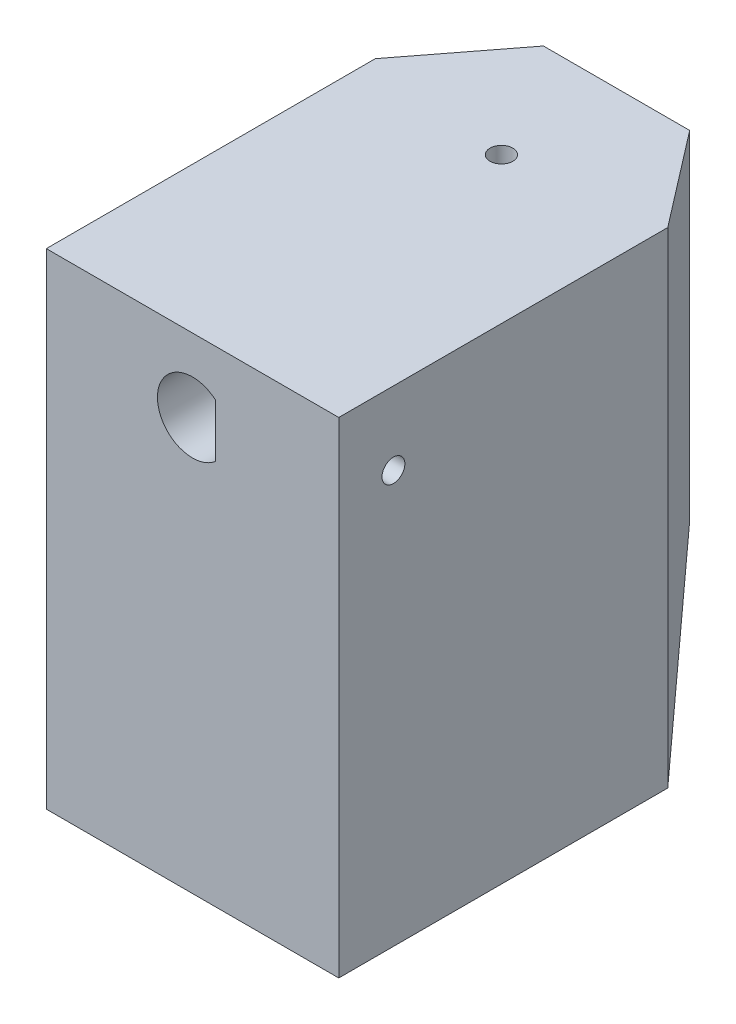
ISO-10303-21;
HEADER;
FILE_DESCRIPTION(('STEP AP214'),'2;1');
FILE_NAME('part.step','',(''),(''),'','','');
FILE_SCHEMA(('AUTOMOTIVE_DESIGN { 1 0 10303 214 1 1 1 1 }'));
ENDSEC;
DATA;
#1=APPLICATION_CONTEXT('core data for automotive mechanical design processes');
#2=APPLICATION_PROTOCOL_DEFINITION('international standard','automotive_design',2000,#1);
#3=PRODUCT_CONTEXT('',#1,'mechanical');
#4=PRODUCT('Part','Part','',(#3));
#5=PRODUCT_RELATED_PRODUCT_CATEGORY('part','',(#4));
#6=PRODUCT_DEFINITION_FORMATION('','',#4);
#7=PRODUCT_DEFINITION_CONTEXT('part definition',#1,'design');
#8=PRODUCT_DEFINITION('design','',#6,#7);
#9=PRODUCT_DEFINITION_SHAPE('','',#8);
#10=(LENGTH_UNIT() NAMED_UNIT(*) SI_UNIT(.MILLI.,.METRE.));
#11=(NAMED_UNIT(*) PLANE_ANGLE_UNIT() SI_UNIT($,.RADIAN.));
#12=(NAMED_UNIT(*) SI_UNIT($,.STERADIAN.) SOLID_ANGLE_UNIT());
#13=UNCERTAINTY_MEASURE_WITH_UNIT(LENGTH_MEASURE(1.E-05),#10,'distance_accuracy_value','');
#14=(GEOMETRIC_REPRESENTATION_CONTEXT(3) GLOBAL_UNCERTAINTY_ASSIGNED_CONTEXT((#13)) GLOBAL_UNIT_ASSIGNED_CONTEXT((#10,
#11,#12)) REPRESENTATION_CONTEXT('',''));
#15=CARTESIAN_POINT('',(0.,0.,0.));
#16=DIRECTION('',(0.,0.,1.));
#17=DIRECTION('',(1.,0.,0.));
#18=AXIS2_PLACEMENT_3D('',#15,#16,#17);
#19=CARTESIAN_POINT('',(12.7,0.,25.4));
#20=DIRECTION('',(1.,0.,0.));
#21=DIRECTION('',(0.,1.,0.));
#22=AXIS2_PLACEMENT_3D('',#19,#20,#21);
#23=PLANE('',#22);
#24=CARTESIAN_POINT('',(12.7,0.,20.65));
#25=DIRECTION('',(1.,0.,0.));
#26=DIRECTION('',(0.,1.,0.));
#27=AXIS2_PLACEMENT_3D('',#24,#25,#26);
#28=CIRCLE('',#27,0.992187500000001);
#29=CARTESIAN_POINT('',(12.7,0.9921875,20.65));
#30=VERTEX_POINT('',#29);
#31=EDGE_CURVE('E257',#30,#30,#28,.T.);
#32=ORIENTED_EDGE('',*,*,#31,.F.);
#33=EDGE_LOOP('',(#32));
#34=FACE_BOUND('',#33,.T.);
#35=DIRECTION('',(0.,-1.,0.));
#36=VECTOR('',#35,1.);
#37=CARTESIAN_POINT('',(12.7,6.351,-3.175));
#38=LINE('',#37,#36);
#39=CARTESIAN_POINT('',(12.7,6.35,-3.175));
#40=VERTEX_POINT('',#39);
#41=CARTESIAN_POINT('',(12.7,-35.814,-3.175));
#42=VERTEX_POINT('',#41);
#43=EDGE_CURVE('E185',#40,#42,#38,.T.);
#44=ORIENTED_EDGE('',*,*,#43,.F.);
#45=DIRECTION('',(0.,0.,1.));
#46=VECTOR('',#45,1.);
#47=CARTESIAN_POINT('',(12.7,6.35,-11.43));
#48=LINE('',#47,#46);
#49=CARTESIAN_POINT('',(12.7,6.35,25.4));
#50=VERTEX_POINT('',#49);
#51=EDGE_CURVE('E60',#40,#50,#48,.T.);
#52=ORIENTED_EDGE('',*,*,#51,.T.);
#53=DIRECTION('',(0.,-1.,0.));
#54=VECTOR('',#53,1.);
#55=CARTESIAN_POINT('',(12.7,0.,25.4));
#56=LINE('',#55,#54);
#57=CARTESIAN_POINT('',(12.7,-35.814,25.4));
#58=VERTEX_POINT('',#57);
#59=EDGE_CURVE('E172',#50,#58,#56,.T.);
#60=ORIENTED_EDGE('',*,*,#59,.T.);
#61=DIRECTION('',(0.,0.,-1.));
#62=VECTOR('',#61,1.);
#63=CARTESIAN_POINT('',(12.7,-35.814,25.4));
#64=LINE('',#63,#62);
#65=EDGE_CURVE('E53',#58,#42,#64,.T.);
#66=ORIENTED_EDGE('',*,*,#65,.T.);
#67=EDGE_LOOP('',(#44,#52,#60,#66));
#68=FACE_BOUND('',#67,.T.);
#69=ADVANCED_FACE('F44',(#34,#68),#23,.T.);
#70=CARTESIAN_POINT('',(0.,6.35,25.4));
#71=DIRECTION('',(0.,1.,0.));
#72=DIRECTION('',(-1.,0.,0.));
#73=AXIS2_PLACEMENT_3D('',#70,#71,#72);
#74=PLANE('',#73);
#75=CARTESIAN_POINT('',(0.,6.35,-1.43));
#76=DIRECTION('',(0.,1.,0.));
#77=DIRECTION('',(-1.,0.,0.));
#78=AXIS2_PLACEMENT_3D('',#75,#76,#77);
#79=CIRCLE('',#78,0.9921875);
#80=CARTESIAN_POINT('',(-0.992187500000001,6.35,-1.43));
#81=VERTEX_POINT('',#80);
#82=EDGE_CURVE('E261',#81,#81,#79,.T.);
#83=ORIENTED_EDGE('',*,*,#82,.F.);
#84=EDGE_LOOP('',(#83));
#85=FACE_BOUND('',#84,.T.);
#86=DIRECTION('',(0.,0.,1.));
#87=VECTOR('',#86,1.);
#88=CARTESIAN_POINT('',(-12.7,6.35,-11.43));
#89=LINE('',#88,#87);
#90=CARTESIAN_POINT('',(-12.7,6.35,-3.175));
#91=VERTEX_POINT('',#90);
#92=CARTESIAN_POINT('',(-12.7,6.35,25.4));
#93=VERTEX_POINT('',#92);
#94=EDGE_CURVE('E150',#91,#93,#89,.T.);
#95=ORIENTED_EDGE('',*,*,#94,.T.);
#96=DIRECTION('',(1.,0.,0.));
#97=VECTOR('',#96,1.);
#98=CARTESIAN_POINT('',(0.,6.35,25.4));
#99=LINE('',#98,#97);
#100=EDGE_CURVE('E154',#93,#50,#99,.T.);
#101=ORIENTED_EDGE('',*,*,#100,.T.);
#102=ORIENTED_EDGE('',*,*,#51,.F.);
#103=DIRECTION('',(-0.609710760849693,0.,-0.7926239891046));
#104=VECTOR('',#103,1.);
#105=CARTESIAN_POINT('',(6.35,6.35,-11.43));
#106=LINE('',#105,#104);
#107=CARTESIAN_POINT('',(6.35,6.35,-11.43));
#108=VERTEX_POINT('',#107);
#109=EDGE_CURVE('E582',#40,#108,#106,.T.);
#110=ORIENTED_EDGE('',*,*,#109,.T.);
#111=DIRECTION('',(1.,0.,0.));
#112=VECTOR('',#111,1.);
#113=CARTESIAN_POINT('',(12.7,6.35,-11.43));
#114=LINE('',#113,#112);
#115=CARTESIAN_POINT('',(-6.35,6.35,-11.43));
#116=VERTEX_POINT('',#115);
#117=EDGE_CURVE('E195',#116,#108,#114,.T.);
#118=ORIENTED_EDGE('',*,*,#117,.F.);
#119=DIRECTION('',(-0.609710760849693,0.,0.7926239891046));
#120=VECTOR('',#119,1.);
#121=CARTESIAN_POINT('',(-12.7,6.35,-3.175));
#122=LINE('',#121,#120);
#123=EDGE_CURVE('E156',#116,#91,#122,.T.);
#124=ORIENTED_EDGE('',*,*,#123,.T.);
#125=EDGE_LOOP('',(#95,#101,#102,#110,#118,#124));
#126=FACE_BOUND('',#125,.T.);
#127=ADVANCED_FACE('F152',(#85,#126),#74,.T.);
#128=CARTESIAN_POINT('',(-12.7,0.,25.4));
#129=DIRECTION('',(1.,0.,0.));
#130=DIRECTION('',(0.,1.,0.));
#131=AXIS2_PLACEMENT_3D('',#128,#129,#130);
#132=PLANE('',#131);
#133=CARTESIAN_POINT('',(-12.7,0.,20.65));
#134=DIRECTION('',(1.,0.,0.));
#135=DIRECTION('',(0.,1.,0.));
#136=AXIS2_PLACEMENT_3D('',#133,#134,#135);
#137=CIRCLE('',#136,0.992187500000001);
#138=CARTESIAN_POINT('',(-12.7,0.992187500000003,20.65));
#139=VERTEX_POINT('',#138);
#140=EDGE_CURVE('E260',#139,#139,#137,.T.);
#141=ORIENTED_EDGE('',*,*,#140,.T.);
#142=EDGE_LOOP('',(#141));
#143=FACE_BOUND('',#142,.T.);
#144=ORIENTED_EDGE('',*,*,#94,.F.);
#145=DIRECTION('',(0.,-1.,0.));
#146=VECTOR('',#145,1.);
#147=CARTESIAN_POINT('',(-12.7,6.351,-3.175));
#148=LINE('',#147,#146);
#149=CARTESIAN_POINT('',(-12.7,-35.814,-3.175));
#150=VERTEX_POINT('',#149);
#151=EDGE_CURVE('E573',#91,#150,#148,.T.);
#152=ORIENTED_EDGE('',*,*,#151,.T.);
#153=DIRECTION('',(0.,0.,-1.));
#154=VECTOR('',#153,1.);
#155=CARTESIAN_POINT('',(-12.7,-35.814,25.4));
#156=LINE('',#155,#154);
#157=CARTESIAN_POINT('',(-12.7,-35.814,25.4));
#158=VERTEX_POINT('',#157);
#159=EDGE_CURVE('E13',#158,#150,#156,.T.);
#160=ORIENTED_EDGE('',*,*,#159,.F.);
#161=DIRECTION('',(0.,-1.,0.));
#162=VECTOR('',#161,1.);
#163=CARTESIAN_POINT('',(-12.7,0.,25.4));
#164=LINE('',#163,#162);
#165=EDGE_CURVE('E163',#93,#158,#164,.T.);
#166=ORIENTED_EDGE('',*,*,#165,.F.);
#167=EDGE_LOOP('',(#144,#152,#160,#166));
#168=FACE_BOUND('',#167,.T.);
#169=ADVANCED_FACE('F164',(#143,#168),#132,.F.);
#170=CARTESIAN_POINT('',(0.,-35.814,25.4));
#171=DIRECTION('',(0.,1.,0.));
#172=DIRECTION('',(0.,0.,1.));
#173=AXIS2_PLACEMENT_3D('',#170,#171,#172);
#174=PLANE('',#173);
#175=DIRECTION('',(0.,0.,1.));
#176=VECTOR('',#175,1.);
#177=CARTESIAN_POINT('',(9.525,-35.814,22.225));
#178=LINE('',#177,#176);
#179=CARTESIAN_POINT('',(9.525,-35.814,3.175));
#180=VERTEX_POINT('',#179);
#181=CARTESIAN_POINT('',(9.525,-35.814,22.225));
#182=VERTEX_POINT('',#181);
#183=EDGE_CURVE('E504',#180,#182,#178,.T.);
#184=ORIENTED_EDGE('',*,*,#183,.F.);
#185=DIRECTION('',(1.,0.,0.));
#186=VECTOR('',#185,1.);
#187=CARTESIAN_POINT('',(-9.525,-35.814,3.175));
#188=LINE('',#187,#186);
#189=CARTESIAN_POINT('',(-9.525,-35.814,3.175));
#190=VERTEX_POINT('',#189);
#191=EDGE_CURVE('E507',#190,#180,#188,.T.);
#192=ORIENTED_EDGE('',*,*,#191,.F.);
#193=DIRECTION('',(0.,0.,-1.));
#194=VECTOR('',#193,1.);
#195=CARTESIAN_POINT('',(-9.525,-35.814,22.225));
#196=LINE('',#195,#194);
#197=CARTESIAN_POINT('',(-9.525,-35.814,22.225));
#198=VERTEX_POINT('',#197);
#199=EDGE_CURVE('E280',#198,#190,#196,.T.);
#200=ORIENTED_EDGE('',*,*,#199,.F.);
#201=DIRECTION('',(-1.,0.,0.));
#202=VECTOR('',#201,1.);
#203=CARTESIAN_POINT('',(-9.525,-35.814,22.225));
#204=LINE('',#203,#202);
#205=EDGE_CURVE('E68',#182,#198,#204,.T.);
#206=ORIENTED_EDGE('',*,*,#205,.F.);
#207=EDGE_LOOP('',(#184,#192,#200,#206));
#208=FACE_BOUND('',#207,.T.);
#209=ORIENTED_EDGE('',*,*,#159,.T.);
#210=DIRECTION('',(1.,0.,0.));
#211=VECTOR('',#210,1.);
#212=CARTESIAN_POINT('',(-14.2885,-35.814,-3.175));
#213=LINE('',#212,#211);
#214=EDGE_CURVE('E190',#150,#42,#213,.T.);
#215=ORIENTED_EDGE('',*,*,#214,.T.);
#216=ORIENTED_EDGE('',*,*,#65,.F.);
#217=DIRECTION('',(1.,0.,0.));
#218=VECTOR('',#217,1.);
#219=CARTESIAN_POINT('',(0.,-35.814,25.4));
#220=LINE('',#219,#218);
#221=EDGE_CURVE('E168',#158,#58,#220,.T.);
#222=ORIENTED_EDGE('',*,*,#221,.F.);
#223=EDGE_LOOP('',(#209,#215,#216,#222));
#224=FACE_BOUND('',#223,.T.);
#225=ADVANCED_FACE('F188',(#208,#224),#174,.F.);
#226=CARTESIAN_POINT('',(0.,0.,25.4));
#227=DIRECTION('',(0.,0.,1.));
#228=DIRECTION('',(1.,0.,0.));
#229=AXIS2_PLACEMENT_3D('',#226,#227,#228);
#230=PLANE('',#229);
#231=ORIENTED_EDGE('',*,*,#100,.F.);
#232=ORIENTED_EDGE('',*,*,#165,.T.);
#233=ORIENTED_EDGE('',*,*,#221,.T.);
#234=ORIENTED_EDGE('',*,*,#59,.F.);
#235=EDGE_LOOP('',(#231,#232,#233,#234));
#236=FACE_BOUND('',#235,.T.);
#237=CARTESIAN_POINT('',(0.,0.,25.4));
#238=DIRECTION('',(0.,0.,1.));
#239=DIRECTION('',(1.,0.,0.));
#240=AXIS2_PLACEMENT_3D('',#237,#238,#239);
#241=CIRCLE('',#240,3.05);
#242=CARTESIAN_POINT('',(2.00312256240101,2.3,25.4));
#243=VERTEX_POINT('',#242);
#244=CARTESIAN_POINT('',(2.00312256240101,-2.3,25.4));
#245=VERTEX_POINT('',#244);
#246=EDGE_CURVE('E160',#243,#245,#241,.T.);
#247=ORIENTED_EDGE('',*,*,#246,.F.);
#248=DIRECTION('',(0.,1.,0.));
#249=VECTOR('',#248,1.);
#250=CARTESIAN_POINT('',(2.00312256240101,2.3,25.4));
#251=LINE('',#250,#249);
#252=EDGE_CURVE('E214',#245,#243,#251,.T.);
#253=ORIENTED_EDGE('',*,*,#252,.F.);
#254=EDGE_LOOP('',(#247,#253));
#255=FACE_BOUND('',#254,.T.);
#256=ADVANCED_FACE('F170',(#236,#255),#230,.T.);
#257=CARTESIAN_POINT('',(0.,0.,15.9));
#258=DIRECTION('',(0.,0.,1.));
#259=DIRECTION('',(1.,0.,0.));
#260=AXIS2_PLACEMENT_3D('',#257,#258,#259);
#261=CYLINDRICAL_SURFACE('',#260,3.05);
#262=CARTESIAN_POINT('',(-2.88410540113286,0.992187500000002,20.65));
#263=CARTESIAN_POINT('',(-2.88410544227333,0.992187499003058,20.5958755878596));
#264=CARTESIAN_POINT('',(-2.88564564639046,0.987743722350948,20.5417506382407));
#265=CARTESIAN_POINT('',(-2.89160993282774,0.970142380682304,20.4350990117294));
#266=CARTESIAN_POINT('',(-2.89603460657639,0.956983028624878,20.382572664925));
#267=CARTESIAN_POINT('',(-2.90721478367813,0.9224574538793,20.2806796461713));
#268=CARTESIAN_POINT('',(-2.91396589215871,0.901106697031612,20.231307223122));
#269=CARTESIAN_POINT('',(-2.9290319786145,0.850856739146813,20.1368299867803));
#270=CARTESIAN_POINT('',(-2.93734727535555,0.821955999031484,20.0917260461827));
#271=CARTESIAN_POINT('',(-2.9549521826214,0.756273448351369,20.0053861005485));
#272=CARTESIAN_POINT('',(-2.96426522492773,0.719258279234333,19.9643323552998));
#273=CARTESIAN_POINT('',(-2.98261770503291,0.638896136400684,19.8888916689228));
#274=CARTESIAN_POINT('',(-2.99165710103225,0.595548201185811,19.8545057420117));
#275=CARTESIAN_POINT('',(-3.00871380936081,0.502427251127224,19.7925587352875));
#276=CARTESIAN_POINT('',(-3.0167003384296,0.452521916038908,19.7651873408911));
#277=CARTESIAN_POINT('',(-3.03047632711017,0.348511403507998,19.7192990230443));
#278=CARTESIAN_POINT('',(-3.03626634888515,0.294407304951968,19.7007798336886));
#279=CARTESIAN_POINT('',(-3.04483101893703,0.185445026179661,19.6737359446256));
#280=CARTESIAN_POINT('',(-3.04769955823871,0.130671786084561,19.6648992986927));
#281=CARTESIAN_POINT('',(-3.05043068306615,0.0203499392450614,19.6564808338436));
#282=CARTESIAN_POINT('',(-3.05029400739354,-0.0351984735751725,19.6568967402816));
#283=CARTESIAN_POINT('',(-3.0470944150492,-0.143290758343074,19.666770826713));
#284=CARTESIAN_POINT('',(-3.04414106581474,-0.195869326720329,19.6758904452371));
#285=CARTESIAN_POINT('',(-3.03577642928814,-0.29870448299637,19.7023549170762));
#286=CARTESIAN_POINT('',(-3.03036497761968,-0.348960915363425,19.7197003204628));
#287=CARTESIAN_POINT('',(-3.01754969538778,-0.446481451629172,19.762329366313));
#288=CARTESIAN_POINT('',(-3.01012123264766,-0.493698981992226,19.787711842417));
#289=CARTESIAN_POINT('',(-2.99404888515526,-0.583306681132967,19.8456139413294));
#290=CARTESIAN_POINT('',(-2.98540467425785,-0.625695548998711,19.8781354806301));
#291=CARTESIAN_POINT('',(-2.96735674542788,-0.70645869874627,19.9511113505771));
#292=CARTESIAN_POINT('',(-2.95793635367576,-0.744566714529424,19.9918566550682));
#293=CARTESIAN_POINT('',(-2.93972858620891,-0.813492417156689,20.079243071153));
#294=CARTESIAN_POINT('',(-2.93094129875284,-0.844309088904597,20.125885002286));
#295=CARTESIAN_POINT('',(-2.91490614917664,-0.898122497898674,20.2245483616709));
#296=CARTESIAN_POINT('',(-2.90767979567869,-0.921012314136455,20.2766318669199));
#297=CARTESIAN_POINT('',(-2.89583486325815,-0.957608885594126,20.384207331038));
#298=CARTESIAN_POINT('',(-2.89121525345138,-0.971319271387314,20.4396979328688));
#299=CARTESIAN_POINT('',(-2.88533839154562,-0.988636876075504,20.5499440962319));
#300=CARTESIAN_POINT('',(-2.88394451250796,-0.992654948014235,20.6046278604142));
#301=CARTESIAN_POINT('',(-2.8842960294371,-0.991633602094448,20.7138948529574));
#302=CARTESIAN_POINT('',(-2.8860408894609,-0.986595730547893,20.7684780968891));
#303=CARTESIAN_POINT('',(-2.89233758463267,-0.967973922785001,20.8741654016898));
#304=CARTESIAN_POINT('',(-2.89679730050704,-0.954670167050479,20.9253248990449));
#305=CARTESIAN_POINT('',(-2.90792133337228,-0.920227585952964,21.0246770677459));
#306=CARTESIAN_POINT('',(-2.91458602922495,-0.899087414054148,21.0728692275519));
#307=CARTESIAN_POINT('',(-2.92962148534836,-0.848836779921624,21.1665496003867));
#308=CARTESIAN_POINT('',(-2.93803814987854,-0.819502534057743,21.2119102118481));
#309=CARTESIAN_POINT('',(-2.95553781207988,-0.75395301969471,21.2972141663049));
#310=CARTESIAN_POINT('',(-2.96462099666982,-0.717735816377705,21.3371559806382));
#311=CARTESIAN_POINT('',(-2.98292990249764,-0.637491602148098,21.4123641680929));
#312=CARTESIAN_POINT('',(-2.99214332635973,-0.59318436675287,21.4473353824276));
#313=CARTESIAN_POINT('',(-3.00926515954649,-0.499105057262503,21.5093625245216));
#314=CARTESIAN_POINT('',(-3.01717362119701,-0.449333202418803,21.5364187696857));
#315=CARTESIAN_POINT('',(-3.03075393221121,-0.346011052220623,21.5815943846169));
#316=CARTESIAN_POINT('',(-3.03644103658824,-0.292489615811174,21.5997749313711));
#317=CARTESIAN_POINT('',(-3.04500428742759,-0.182928910247626,21.6268078899542));
#318=CARTESIAN_POINT('',(-3.04788139509713,-0.126890508929983,21.6356634916205));
#319=CARTESIAN_POINT('',(-3.05043138226181,-0.0165929138099596,21.6435189137842));
#320=CARTESIAN_POINT('',(-3.05024234265781,0.0376331799160615,21.6429434407334));
#321=CARTESIAN_POINT('',(-3.04701763207516,0.145180388094265,21.6329926260583));
#322=CARTESIAN_POINT('',(-3.04398217379008,0.198501569861303,21.6236179419395));
#323=CARTESIAN_POINT('',(-3.03545367873891,0.301958416561305,21.596612386453));
#324=CARTESIAN_POINT('',(-3.02999695832424,0.352129088549445,21.5791033457476));
#325=CARTESIAN_POINT('',(-3.01718794133522,0.448842066153531,21.5364377169793));
#326=CARTESIAN_POINT('',(-3.00983530798857,0.495383725230549,21.5112797700936));
#327=CARTESIAN_POINT('',(-2.993668126611,0.585333264955752,21.4529913889707));
#328=CARTESIAN_POINT('',(-2.98481065485261,0.628569233327403,21.4196077131159));
#329=CARTESIAN_POINT('',(-2.96674391771869,0.708965129504234,21.3462524336054));
#330=CARTESIAN_POINT('',(-2.95753454352048,0.746123158692438,21.3062787791824));
#331=CARTESIAN_POINT('',(-2.93940150193374,0.814693001372457,21.2191195210637));
#332=CARTESIAN_POINT('',(-2.93050078175049,0.845843372263712,21.1717228223373));
#333=CARTESIAN_POINT('',(-2.91441536585923,0.899709614139127,21.072093321709));
#334=CARTESIAN_POINT('',(-2.90723012287973,0.922428176324609,21.0198620695248));
#335=CARTESIAN_POINT('',(-2.89584504366131,0.957550476466852,20.9153043833237));
#336=CARTESIAN_POINT('',(-2.89148992748762,0.97049854817774,20.8631778210159));
#337=CARTESIAN_POINT('',(-2.88562051672608,0.987815759147561,20.7573673637509));
#338=CARTESIAN_POINT('',(-2.88410536032719,0.992187500988832,20.7036839462584));
#339=CARTESIAN_POINT('',(-2.88410540113286,0.992187500000002,20.65));
#340=B_SPLINE_CURVE_WITH_KNOTS('',3,(#262,#263,#264,#265,#266,#267,#268,#269,#270,#271,#272,
#273,#274,#275,#276,#277,#278,#279,#280,#281,#282,#283,#284,#285,#286,#287,#288,#289,#290,#291,
#292,#293,#294,#295,#296,#297,#298,#299,#300,#301,#302,#303,#304,#305,#306,#307,#308,#309,#310,
#311,#312,#313,#314,#315,#316,#317,#318,#319,#320,#321,#322,#323,#324,#325,#326,#327,#328,#329,
#330,#331,#332,#333,#334,#335,#336,#337,#338,#339),.UNSPECIFIED.,.T.,.F.,(4,2,2,2,2,2,2,2,2,2,2,
2,2,2,2,2,2,2,2,2,2,2,2,2,2,2,2,2,2,2,2,2,2,2,2,2,2,2,4),(0.,0.162174630996264,0.32438252456463,
0.486285655638667,0.648221816758152,0.815631303538281,0.983066234419227,1.15463942416469,
1.32616867264438,1.49199254632288,1.65777565433925,1.81736215241872,1.97695932381421,
2.13860074566675,2.30028561358634,2.46924159712235,2.63822108877886,2.80939836914192,
2.98050790680865,3.14422583660701,3.30791581405046,3.46633914965661,3.62478971986229,
3.78808146355611,3.95141917707508,4.12218357997324,4.29294113396466,4.46250449013404,
4.63200982393432,4.79390371610393,4.95578551200371,5.11531727100793,5.27487738729246,
5.44015156575835,5.60547727411764,5.77688035855631,5.94822868870398,6.10913237387438,
6.26998722348073),.UNSPECIFIED.);
#341=CARTESIAN_POINT('',(-2.88410540113286,0.992187500000002,20.65));
#342=VERTEX_POINT('',#341);
#343=EDGE_CURVE('E271',#342,#342,#340,.T.);
#344=ORIENTED_EDGE('',*,*,#343,.T.);
#345=EDGE_LOOP('',(#344));
#346=FACE_BOUND('',#345,.T.);
#347=ORIENTED_EDGE('',*,*,#246,.T.);
#348=DIRECTION('',(0.,0.,1.));
#349=VECTOR('',#348,1.);
#350=CARTESIAN_POINT('',(2.00312256240101,-2.3,15.9));
#351=LINE('',#350,#349);
#352=CARTESIAN_POINT('',(2.00312256240101,-2.3,15.9));
#353=VERTEX_POINT('',#352);
#354=EDGE_CURVE('E218',#353,#245,#351,.T.);
#355=ORIENTED_EDGE('',*,*,#354,.F.);
#356=CARTESIAN_POINT('',(0.,0.,15.9));
#357=DIRECTION('',(0.,0.,1.));
#358=DIRECTION('',(1.,0.,0.));
#359=AXIS2_PLACEMENT_3D('',#356,#357,#358);
#360=CIRCLE('',#359,3.05);
#361=CARTESIAN_POINT('',(2.00312256240101,2.3,15.9));
#362=VERTEX_POINT('',#361);
#363=EDGE_CURVE('E209',#362,#353,#360,.T.);
#364=ORIENTED_EDGE('',*,*,#363,.F.);
#365=DIRECTION('',(0.,0.,1.));
#366=VECTOR('',#365,1.);
#367=CARTESIAN_POINT('',(2.00312256240101,2.3,15.9));
#368=LINE('',#367,#366);
#369=EDGE_CURVE('E176',#362,#243,#368,.T.);
#370=ORIENTED_EDGE('',*,*,#369,.T.);
#371=EDGE_LOOP('',(#347,#355,#364,#370));
#372=FACE_BOUND('',#371,.T.);
#373=ADVANCED_FACE('F234',(#346,#372),#261,.F.);
#374=CARTESIAN_POINT('',(2.00312256240101,2.3,15.9));
#375=DIRECTION('',(1.,0.,0.));
#376=DIRECTION('',(0.,0.,-1.));
#377=AXIS2_PLACEMENT_3D('',#374,#375,#376);
#378=PLANE('',#377);
#379=CARTESIAN_POINT('',(2.00312256240101,0.,20.65));
#380=DIRECTION('',(1.,0.,0.));
#381=DIRECTION('',(0.,0.,-1.));
#382=AXIS2_PLACEMENT_3D('',#379,#380,#381);
#383=CIRCLE('',#382,0.992187500000001);
#384=CARTESIAN_POINT('',(2.00312256240101,0.,19.6578125));
#385=VERTEX_POINT('',#384);
#386=EDGE_CURVE('E47',#385,#385,#383,.T.);
#387=ORIENTED_EDGE('',*,*,#386,.T.);
#388=EDGE_LOOP('',(#387));
#389=FACE_BOUND('',#388,.T.);
#390=ORIENTED_EDGE('',*,*,#252,.T.);
#391=ORIENTED_EDGE('',*,*,#369,.F.);
#392=DIRECTION('',(0.,1.,0.));
#393=VECTOR('',#392,1.);
#394=CARTESIAN_POINT('',(2.00312256240101,2.3,15.9));
#395=LINE('',#394,#393);
#396=EDGE_CURVE('E213',#353,#362,#395,.T.);
#397=ORIENTED_EDGE('',*,*,#396,.F.);
#398=ORIENTED_EDGE('',*,*,#354,.T.);
#399=EDGE_LOOP('',(#390,#391,#397,#398));
#400=FACE_BOUND('',#399,.T.);
#401=ADVANCED_FACE('F230',(#389,#400),#378,.F.);
#402=CARTESIAN_POINT('',(0.,0.,15.9));
#403=DIRECTION('',(0.,0.,1.));
#404=DIRECTION('',(1.,0.,0.));
#405=AXIS2_PLACEMENT_3D('',#402,#403,#404);
#406=PLANE('',#405);
#407=ORIENTED_EDGE('',*,*,#363,.T.);
#408=ORIENTED_EDGE('',*,*,#396,.T.);
#409=EDGE_LOOP('',(#407,#408));
#410=FACE_BOUND('',#409,.T.);
#411=ADVANCED_FACE('F236',(#410),#406,.T.);
#412=CARTESIAN_POINT('',(0.,0.,-11.43));
#413=DIRECTION('',(0.,0.,-1.));
#414=DIRECTION('',(-1.,0.,0.));
#415=AXIS2_PLACEMENT_3D('',#412,#413,#414);
#416=PLANE('',#415);
#417=CARTESIAN_POINT('',(0.,0.,-11.43));
#418=DIRECTION('',(0.,0.,-1.));
#419=DIRECTION('',(-1.,0.,0.));
#420=AXIS2_PLACEMENT_3D('',#417,#418,#419);
#421=CIRCLE('',#420,3.302);
#422=CARTESIAN_POINT('',(1.651,2.85961588329622,-11.43));
#423=VERTEX_POINT('',#422);
#424=CARTESIAN_POINT('',(-1.651,2.85961588329622,-11.43));
#425=VERTEX_POINT('',#424);
#426=EDGE_CURVE('E545',#423,#425,#421,.T.);
#427=ORIENTED_EDGE('',*,*,#426,.F.);
#428=DIRECTION('',(1.,0.,0.));
#429=VECTOR('',#428,1.);
#430=CARTESIAN_POINT('',(1.651,2.85961588329622,-11.43));
#431=LINE('',#430,#429);
#432=EDGE_CURVE('E551',#425,#423,#431,.T.);
#433=ORIENTED_EDGE('',*,*,#432,.F.);
#434=EDGE_LOOP('',(#427,#433));
#435=FACE_BOUND('',#434,.T.);
#436=DIRECTION('',(0.,-1.,0.));
#437=VECTOR('',#436,1.);
#438=CARTESIAN_POINT('',(-6.35,6.351,-11.43));
#439=LINE('',#438,#437);
#440=CARTESIAN_POINT('',(-6.35,-23.01875,-11.43));
#441=VERTEX_POINT('',#440);
#442=EDGE_CURVE('E571',#116,#441,#439,.T.);
#443=ORIENTED_EDGE('',*,*,#442,.F.);
#444=ORIENTED_EDGE('',*,*,#117,.T.);
#445=DIRECTION('',(0.,-1.,0.));
#446=VECTOR('',#445,1.);
#447=CARTESIAN_POINT('',(6.35,6.351,-11.43));
#448=LINE('',#447,#446);
#449=CARTESIAN_POINT('',(6.35,-23.01875,-11.43));
#450=VERTEX_POINT('',#449);
#451=EDGE_CURVE('E572',#108,#450,#448,.T.);
#452=ORIENTED_EDGE('',*,*,#451,.T.);
#453=DIRECTION('',(1.,0.,0.));
#454=VECTOR('',#453,1.);
#455=CARTESIAN_POINT('',(-14.2885,-23.01875,-11.43));
#456=LINE('',#455,#454);
#457=EDGE_CURVE('E196',#441,#450,#456,.T.);
#458=ORIENTED_EDGE('',*,*,#457,.F.);
#459=EDGE_LOOP('',(#443,#444,#452,#458));
#460=FACE_BOUND('',#459,.T.);
#461=ADVANCED_FACE('F238',(#435,#460),#416,.T.);
#462=CARTESIAN_POINT('',(-14.2885,-35.814,-3.175));
#463=DIRECTION('',(0.,0.542126869822093,0.840296648224244));
#464=DIRECTION('',(0.,-0.840296648224244,0.542126869822093));
#465=AXIS2_PLACEMENT_3D('',#462,#463,#464);
#466=PLANE('',#465);
#467=ORIENTED_EDGE('',*,*,#214,.F.);
#468=DIRECTION('',(-0.38489376461713,-0.775560935703517,0.500361894002269));
#469=VECTOR('',#468,1.);
#470=CARTESIAN_POINT('',(-0.113386220459314,-10.4519732342255,-19.5375979134029));
#471=LINE('',#470,#469);
#472=EDGE_CURVE('E568',#441,#150,#471,.T.);
#473=ORIENTED_EDGE('',*,*,#472,.F.);
#474=ORIENTED_EDGE('',*,*,#457,.T.);
#475=DIRECTION('',(-0.384893764617131,0.775560935703517,-0.500361894002269));
#476=VECTOR('',#475,1.);
#477=CARTESIAN_POINT('',(-2.41712202185854,-5.35299912595507,-22.8272586284161));
#478=LINE('',#477,#476);
#479=EDGE_CURVE('E564',#42,#450,#478,.T.);
#480=ORIENTED_EDGE('',*,*,#479,.F.);
#481=EDGE_LOOP('',(#467,#473,#474,#480));
#482=FACE_BOUND('',#481,.T.);
#483=ADVANCED_FACE('F244',(#482),#466,.F.);
#484=CARTESIAN_POINT('',(6.35,6.351,-11.43));
#485=DIRECTION('',(-0.7926239891046,0.,0.609710760849693));
#486=DIRECTION('',(0.609710760849693,0.,0.7926239891046));
#487=AXIS2_PLACEMENT_3D('',#484,#485,#486);
#488=PLANE('',#487);
#489=ORIENTED_EDGE('',*,*,#43,.T.);
#490=ORIENTED_EDGE('',*,*,#479,.T.);
#491=ORIENTED_EDGE('',*,*,#451,.F.);
#492=ORIENTED_EDGE('',*,*,#109,.F.);
#493=EDGE_LOOP('',(#489,#490,#491,#492));
#494=FACE_BOUND('',#493,.T.);
#495=ADVANCED_FACE('F326',(#494),#488,.F.);
#496=CARTESIAN_POINT('',(-12.7,6.351,-3.175));
#497=DIRECTION('',(0.7926239891046,0.,0.609710760849693));
#498=DIRECTION('',(0.609710760849693,0.,-0.7926239891046));
#499=AXIS2_PLACEMENT_3D('',#496,#497,#498);
#500=PLANE('',#499);
#501=ORIENTED_EDGE('',*,*,#442,.T.);
#502=ORIENTED_EDGE('',*,*,#472,.T.);
#503=ORIENTED_EDGE('',*,*,#151,.F.);
#504=ORIENTED_EDGE('',*,*,#123,.F.);
#505=EDGE_LOOP('',(#501,#502,#503,#504));
#506=FACE_BOUND('',#505,.T.);
#507=ADVANCED_FACE('F322',(#506),#500,.F.);
#508=CARTESIAN_POINT('',(0.,0.,8.57));
#509=DIRECTION('',(0.,0.,-1.));
#510=DIRECTION('',(-1.,0.,0.));
#511=AXIS2_PLACEMENT_3D('',#508,#509,#510);
#512=CYLINDRICAL_SURFACE('',#511,3.302);
#513=ORIENTED_EDGE('',*,*,#426,.T.);
#514=DIRECTION('',(0.,0.,-1.));
#515=VECTOR('',#514,1.);
#516=CARTESIAN_POINT('',(-1.651,2.85961588329622,8.57));
#517=LINE('',#516,#515);
#518=CARTESIAN_POINT('',(-1.651,2.85961588329622,8.57));
#519=VERTEX_POINT('',#518);
#520=EDGE_CURVE('E555',#519,#425,#517,.T.);
#521=ORIENTED_EDGE('',*,*,#520,.F.);
#522=CARTESIAN_POINT('',(0.,0.,8.57));
#523=DIRECTION('',(0.,0.,-1.));
#524=DIRECTION('',(-1.,0.,0.));
#525=AXIS2_PLACEMENT_3D('',#522,#523,#524);
#526=CIRCLE('',#525,3.302);
#527=CARTESIAN_POINT('',(1.651,2.85961588329622,8.57));
#528=VERTEX_POINT('',#527);
#529=EDGE_CURVE('E546',#528,#519,#526,.T.);
#530=ORIENTED_EDGE('',*,*,#529,.F.);
#531=DIRECTION('',(0.,0.,-1.));
#532=VECTOR('',#531,1.);
#533=CARTESIAN_POINT('',(1.651,2.85961588329622,8.57));
#534=LINE('',#533,#532);
#535=EDGE_CURVE('E561',#528,#423,#534,.T.);
#536=ORIENTED_EDGE('',*,*,#535,.T.);
#537=EDGE_LOOP('',(#513,#521,#530,#536));
#538=FACE_BOUND('',#537,.T.);
#539=ADVANCED_FACE('F318',(#538),#512,.F.);
#540=CARTESIAN_POINT('',(1.651,2.85961588329622,8.57));
#541=DIRECTION('',(0.,1.,0.));
#542=DIRECTION('',(0.,0.,1.));
#543=AXIS2_PLACEMENT_3D('',#540,#541,#542);
#544=PLANE('',#543);
#545=CARTESIAN_POINT('',(0.,2.85961588329622,-1.43));
#546=DIRECTION('',(0.,1.,0.));
#547=DIRECTION('',(0.,0.,1.));
#548=AXIS2_PLACEMENT_3D('',#545,#546,#547);
#549=CIRCLE('',#548,0.9921875);
#550=CARTESIAN_POINT('',(0.,2.85961588329622,-0.437812499999999));
#551=VERTEX_POINT('',#550);
#552=EDGE_CURVE('E268',#551,#551,#549,.F.);
#553=ORIENTED_EDGE('',*,*,#552,.F.);
#554=EDGE_LOOP('',(#553));
#555=FACE_BOUND('',#554,.T.);
#556=ORIENTED_EDGE('',*,*,#432,.T.);
#557=ORIENTED_EDGE('',*,*,#535,.F.);
#558=DIRECTION('',(1.,0.,0.));
#559=VECTOR('',#558,1.);
#560=CARTESIAN_POINT('',(1.651,2.85961588329622,8.57));
#561=LINE('',#560,#559);
#562=EDGE_CURVE('E550',#519,#528,#561,.T.);
#563=ORIENTED_EDGE('',*,*,#562,.F.);
#564=ORIENTED_EDGE('',*,*,#520,.T.);
#565=EDGE_LOOP('',(#556,#557,#563,#564));
#566=FACE_BOUND('',#565,.T.);
#567=ADVANCED_FACE('F314',(#555,#566),#544,.F.);
#568=CARTESIAN_POINT('',(0.,0.,8.57));
#569=DIRECTION('',(0.,0.,-1.));
#570=DIRECTION('',(-1.,0.,0.));
#571=AXIS2_PLACEMENT_3D('',#568,#569,#570);
#572=PLANE('',#571);
#573=ORIENTED_EDGE('',*,*,#529,.T.);
#574=ORIENTED_EDGE('',*,*,#562,.T.);
#575=EDGE_LOOP('',(#573,#574));
#576=FACE_BOUND('',#575,.T.);
#577=ADVANCED_FACE('F310',(#576),#572,.T.);
#578=CARTESIAN_POINT('',(0.,-9.52499999999996,25.4));
#579=DIRECTION('',(0.,1.,0.));
#580=DIRECTION('',(-1.,0.,0.));
#581=AXIS2_PLACEMENT_3D('',#578,#579,#580);
#582=PLANE('',#581);
#583=DIRECTION('',(0.,0.,-1.));
#584=VECTOR('',#583,1.);
#585=CARTESIAN_POINT('',(-9.525,-9.52499999999993,22.225));
#586=LINE('',#585,#584);
#587=CARTESIAN_POINT('',(-9.525,-9.52499999999993,22.225));
#588=VERTEX_POINT('',#587);
#589=CARTESIAN_POINT('',(-9.525,-9.52499999999993,3.175));
#590=VERTEX_POINT('',#589);
#591=EDGE_CURVE('E522',#588,#590,#586,.T.);
#592=ORIENTED_EDGE('',*,*,#591,.T.);
#593=DIRECTION('',(1.,0.,0.));
#594=VECTOR('',#593,1.);
#595=CARTESIAN_POINT('',(-9.5250000000001,-9.52499999999993,3.175));
#596=LINE('',#595,#594);
#597=CARTESIAN_POINT('',(9.525,-9.52499999999996,3.175));
#598=VERTEX_POINT('',#597);
#599=EDGE_CURVE('E512',#590,#598,#596,.T.);
#600=ORIENTED_EDGE('',*,*,#599,.T.);
#601=DIRECTION('',(0.,0.,1.));
#602=VECTOR('',#601,1.);
#603=CARTESIAN_POINT('',(9.525,-9.52499999999999,22.225));
#604=LINE('',#603,#602);
#605=CARTESIAN_POINT('',(9.525,-9.52499999999999,22.225));
#606=VERTEX_POINT('',#605);
#607=EDGE_CURVE('E533',#598,#606,#604,.T.);
#608=ORIENTED_EDGE('',*,*,#607,.T.);
#609=DIRECTION('',(-1.,0.,0.));
#610=VECTOR('',#609,1.);
#611=CARTESIAN_POINT('',(-9.5250000000001,-9.52499999999993,22.225));
#612=LINE('',#611,#610);
#613=EDGE_CURVE('E528',#606,#588,#612,.T.);
#614=ORIENTED_EDGE('',*,*,#613,.T.);
#615=EDGE_LOOP('',(#592,#600,#608,#614));
#616=FACE_BOUND('',#615,.T.);
#617=ADVANCED_FACE('F306',(#616),#582,.F.);
#618=CARTESIAN_POINT('',(-9.525,20.5907683632075,3.175));
#619=DIRECTION('',(0.,0.,-1.));
#620=DIRECTION('',(-1.,0.,0.));
#621=AXIS2_PLACEMENT_3D('',#618,#619,#620);
#622=PLANE('',#621);
#623=DIRECTION('',(0.,-1.,0.));
#624=VECTOR('',#623,1.);
#625=CARTESIAN_POINT('',(-9.525,20.5907683632075,3.175));
#626=LINE('',#625,#624);
#627=EDGE_CURVE('E526',#590,#190,#626,.T.);
#628=ORIENTED_EDGE('',*,*,#627,.T.);
#629=ORIENTED_EDGE('',*,*,#191,.T.);
#630=DIRECTION('',(0.,-1.,0.));
#631=VECTOR('',#630,1.);
#632=CARTESIAN_POINT('',(9.525,20.5907683632075,3.175));
#633=LINE('',#632,#631);
#634=EDGE_CURVE('E521',#598,#180,#633,.T.);
#635=ORIENTED_EDGE('',*,*,#634,.F.);
#636=ORIENTED_EDGE('',*,*,#599,.F.);
#637=EDGE_LOOP('',(#628,#629,#635,#636));
#638=FACE_BOUND('',#637,.T.);
#639=ADVANCED_FACE('F302',(#638),#622,.F.);
#640=CARTESIAN_POINT('',(9.525,20.5907683632075,22.225));
#641=DIRECTION('',(1.,0.,0.));
#642=DIRECTION('',(0.,0.,-1.));
#643=AXIS2_PLACEMENT_3D('',#640,#641,#642);
#644=PLANE('',#643);
#645=ORIENTED_EDGE('',*,*,#634,.T.);
#646=ORIENTED_EDGE('',*,*,#183,.T.);
#647=DIRECTION('',(0.,-1.,0.));
#648=VECTOR('',#647,1.);
#649=CARTESIAN_POINT('',(9.525,20.5907683632075,22.225));
#650=LINE('',#649,#648);
#651=EDGE_CURVE('E532',#606,#182,#650,.T.);
#652=ORIENTED_EDGE('',*,*,#651,.F.);
#653=ORIENTED_EDGE('',*,*,#607,.F.);
#654=EDGE_LOOP('',(#645,#646,#652,#653));
#655=FACE_BOUND('',#654,.T.);
#656=ADVANCED_FACE('F299',(#655),#644,.F.);
#657=CARTESIAN_POINT('',(-9.525,20.5907683632075,22.225));
#658=DIRECTION('',(0.,0.,1.));
#659=DIRECTION('',(1.,0.,0.));
#660=AXIS2_PLACEMENT_3D('',#657,#658,#659);
#661=PLANE('',#660);
#662=ORIENTED_EDGE('',*,*,#651,.T.);
#663=ORIENTED_EDGE('',*,*,#205,.T.);
#664=DIRECTION('',(0.,-1.,0.));
#665=VECTOR('',#664,1.);
#666=CARTESIAN_POINT('',(-9.525,20.5907683632075,22.225));
#667=LINE('',#666,#665);
#668=EDGE_CURVE('E527',#588,#198,#667,.T.);
#669=ORIENTED_EDGE('',*,*,#668,.F.);
#670=ORIENTED_EDGE('',*,*,#613,.F.);
#671=EDGE_LOOP('',(#662,#663,#669,#670));
#672=FACE_BOUND('',#671,.T.);
#673=ADVANCED_FACE('F295',(#672),#661,.F.);
#674=CARTESIAN_POINT('',(-9.525,20.5907683632075,22.225));
#675=DIRECTION('',(-1.,0.,0.));
#676=DIRECTION('',(0.,0.,1.));
#677=AXIS2_PLACEMENT_3D('',#674,#675,#676);
#678=PLANE('',#677);
#679=ORIENTED_EDGE('',*,*,#668,.T.);
#680=ORIENTED_EDGE('',*,*,#199,.T.);
#681=ORIENTED_EDGE('',*,*,#627,.F.);
#682=ORIENTED_EDGE('',*,*,#591,.F.);
#683=EDGE_LOOP('',(#679,#680,#681,#682));
#684=FACE_BOUND('',#683,.T.);
#685=ADVANCED_FACE('F292',(#684),#678,.F.);
#686=CARTESIAN_POINT('',(-12.7,0.,20.65));
#687=DIRECTION('',(1.,0.,0.));
#688=DIRECTION('',(0.,1.,0.));
#689=AXIS2_PLACEMENT_3D('',#686,#687,#688);
#690=CYLINDRICAL_SURFACE('',#689,0.992187500000001);
#691=ORIENTED_EDGE('',*,*,#31,.T.);
#692=EDGE_LOOP('',(#691));
#693=FACE_BOUND('',#692,.T.);
#694=ORIENTED_EDGE('',*,*,#386,.F.);
#695=EDGE_LOOP('',(#694));
#696=FACE_BOUND('',#695,.T.);
#697=ADVANCED_FACE('F290',(#693,#696),#690,.F.);
#698=ORIENTED_EDGE('',*,*,#140,.F.);
#699=EDGE_LOOP('',(#698));
#700=FACE_BOUND('',#699,.T.);
#701=ORIENTED_EDGE('',*,*,#343,.F.);
#702=EDGE_LOOP('',(#701));
#703=FACE_BOUND('',#702,.T.);
#704=ADVANCED_FACE('F284',(#700,#703),#690,.F.);
#705=CARTESIAN_POINT('',(0.,-35.815,-1.43));
#706=DIRECTION('',(0.,1.,0.));
#707=DIRECTION('',(-1.,0.,0.));
#708=AXIS2_PLACEMENT_3D('',#705,#706,#707);
#709=CYLINDRICAL_SURFACE('',#708,0.9921875);
#710=ORIENTED_EDGE('',*,*,#82,.T.);
#711=EDGE_LOOP('',(#710));
#712=FACE_BOUND('',#711,.T.);
#713=ORIENTED_EDGE('',*,*,#552,.T.);
#714=EDGE_LOOP('',(#713));
#715=FACE_BOUND('',#714,.T.);
#716=ADVANCED_FACE('F289',(#712,#715),#709,.F.);
#717=CLOSED_SHELL('',(#69,#127,#169,#225,#256,#373,#401,#411,#461,#483,#495,#507,#539,#567,#577,
#617,#639,#656,#673,#685,#697,#704,#716));
#718=MANIFOLD_SOLID_BREP('B2',#717);
#719=ADVANCED_BREP_SHAPE_REPRESENTATION('',(#18,#718),#14);
#720=SHAPE_DEFINITION_REPRESENTATION(#9,#719);
ENDSEC;
END-ISO-10303-21;
